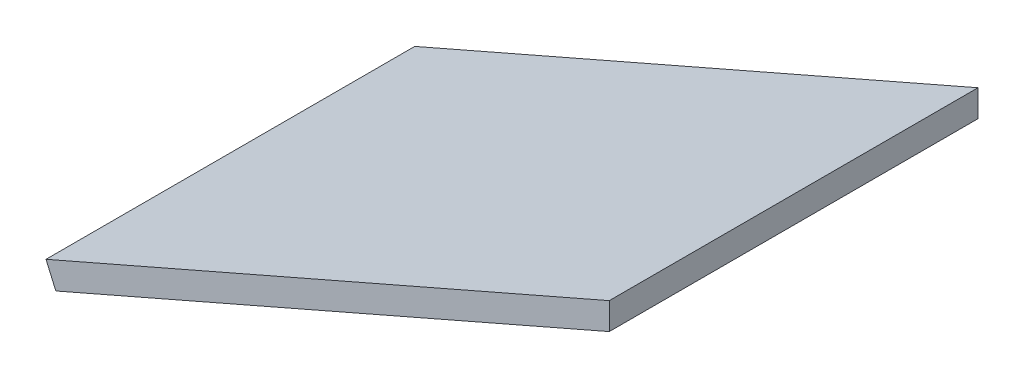
ISO-10303-21;
HEADER;
FILE_DESCRIPTION(('STEP AP214'),'2;1');
FILE_NAME('part.step','',(''),(''),'','','');
FILE_SCHEMA(('AUTOMOTIVE_DESIGN { 1 0 10303 214 1 1 1 1 }'));
ENDSEC;
DATA;
#1=APPLICATION_CONTEXT('core data for automotive mechanical design processes');
#2=APPLICATION_PROTOCOL_DEFINITION('international standard','automotive_design',2000,#1);
#3=PRODUCT_CONTEXT('',#1,'mechanical');
#4=PRODUCT('Part','Part','',(#3));
#5=PRODUCT_RELATED_PRODUCT_CATEGORY('part','',(#4));
#6=PRODUCT_DEFINITION_FORMATION('','',#4);
#7=PRODUCT_DEFINITION_CONTEXT('part definition',#1,'design');
#8=PRODUCT_DEFINITION('design','',#6,#7);
#9=PRODUCT_DEFINITION_SHAPE('','',#8);
#10=(LENGTH_UNIT() NAMED_UNIT(*) SI_UNIT(.MILLI.,.METRE.));
#11=(NAMED_UNIT(*) PLANE_ANGLE_UNIT() SI_UNIT($,.RADIAN.));
#12=(NAMED_UNIT(*) SI_UNIT($,.STERADIAN.) SOLID_ANGLE_UNIT());
#13=UNCERTAINTY_MEASURE_WITH_UNIT(LENGTH_MEASURE(1.E-05),#10,'distance_accuracy_value','');
#14=(GEOMETRIC_REPRESENTATION_CONTEXT(3) GLOBAL_UNCERTAINTY_ASSIGNED_CONTEXT((#13)) GLOBAL_UNIT_ASSIGNED_CONTEXT((#10,
#11,#12)) REPRESENTATION_CONTEXT('',''));
#15=CARTESIAN_POINT('',(0.,0.,0.));
#16=DIRECTION('',(0.,0.,1.));
#17=DIRECTION('',(1.,0.,0.));
#18=AXIS2_PLACEMENT_3D('',#15,#16,#17);
#19=CARTESIAN_POINT('',(22.1128784747792,11.8330302779824,30.));
#20=DIRECTION('',(-0.999999999999995,0.,0.));
#21=DIRECTION('',(0.,0.,0.999999999999989));
#22=AXIS2_PLACEMENT_3D('',#19,#20,#21);
#23=PLANE('',#22);
#24=DIRECTION('',(0.,0.999999999999995,0.));
#25=VECTOR('',#24,1.);
#26=CARTESIAN_POINT('',(22.1128784747792,11.8330302779824,0.));
#27=LINE('',#26,#25);
#28=CARTESIAN_POINT('',(22.1128784747792,9.65085137562245,0.));
#29=VERTEX_POINT('',#28);
#30=CARTESIAN_POINT('',(22.1128784747792,11.8330302779824,0.));
#31=VERTEX_POINT('',#30);
#32=EDGE_CURVE('E93',#29,#31,#27,.T.);
#33=ORIENTED_EDGE('',*,*,#32,.T.);
#34=DIRECTION('',(0.,0.,-0.999999999999989));
#35=VECTOR('',#34,1.);
#36=CARTESIAN_POINT('',(22.1128784747792,11.8330302779824,30.));
#37=LINE('',#36,#35);
#38=CARTESIAN_POINT('',(22.1128784747792,11.8330302779824,30.));
#39=VERTEX_POINT('',#38);
#40=EDGE_CURVE('E11',#39,#31,#37,.T.);
#41=ORIENTED_EDGE('',*,*,#40,.F.);
#42=DIRECTION('',(0.,0.999999999999995,0.));
#43=VECTOR('',#42,1.);
#44=CARTESIAN_POINT('',(22.1128784747792,11.8330302779824,30.));
#45=LINE('',#44,#43);
#46=CARTESIAN_POINT('',(22.1128784747792,9.65085137562245,30.));
#47=VERTEX_POINT('',#46);
#48=EDGE_CURVE('E81',#47,#39,#45,.T.);
#49=ORIENTED_EDGE('',*,*,#48,.F.);
#50=DIRECTION('',(0.,0.,-0.999999999999989));
#51=VECTOR('',#50,1.);
#52=CARTESIAN_POINT('',(22.1128784747792,9.65085137562245,30.));
#53=LINE('',#52,#51);
#54=EDGE_CURVE('E89',#47,#29,#53,.T.);
#55=ORIENTED_EDGE('',*,*,#54,.T.);
#56=EDGE_LOOP('',(#33,#41,#49,#55));
#57=FACE_BOUND('',#56,.T.);
#58=ADVANCED_FACE('F30',(#57),#23,.F.);
#59=CARTESIAN_POINT('',(22.1128784747792,11.8330302779824,30.));
#60=DIRECTION('',(0.400000000000001,-0.916515138991168,0.));
#61=DIRECTION('',(0.916515138991168,0.400000000000001,0.));
#62=AXIS2_PLACEMENT_3D('',#59,#60,#61);
#63=PLANE('',#62);
#64=DIRECTION('',(-0.916515138991168,-0.400000000000001,0.));
#65=VECTOR('',#64,1.);
#66=CARTESIAN_POINT('',(22.1128784747792,11.8330302779824,0.));
#67=LINE('',#66,#65);
#68=CARTESIAN_POINT('',(-23.7128784747792,-8.1669697220177,0.));
#69=VERTEX_POINT('',#68);
#70=EDGE_CURVE('E85',#31,#69,#67,.T.);
#71=ORIENTED_EDGE('',*,*,#70,.T.);
#72=DIRECTION('',(0.,0.,-0.999999999999989));
#73=VECTOR('',#72,1.);
#74=CARTESIAN_POINT('',(-23.7128784747791,-8.16696972201762,29.9999999999993));
#75=LINE('',#74,#73);
#76=CARTESIAN_POINT('',(-23.7128784747791,-8.16696972201762,29.9999999999993));
#77=VERTEX_POINT('',#76);
#78=EDGE_CURVE('E38',#77,#69,#75,.T.);
#79=ORIENTED_EDGE('',*,*,#78,.F.);
#80=DIRECTION('',(-0.916515138991168,-0.400000000000001,0.));
#81=VECTOR('',#80,1.);
#82=CARTESIAN_POINT('',(22.1128784747792,11.8330302779824,30.));
#83=LINE('',#82,#81);
#84=EDGE_CURVE('E76',#39,#77,#83,.T.);
#85=ORIENTED_EDGE('',*,*,#84,.F.);
#86=ORIENTED_EDGE('',*,*,#40,.T.);
#87=EDGE_LOOP('',(#71,#79,#85,#86));
#88=FACE_BOUND('',#87,.T.);
#89=ADVANCED_FACE('F84',(#88),#63,.F.);
#90=CARTESIAN_POINT('',(-22.912878474779,-10.0000000000001,29.9999999999993));
#91=DIRECTION('',(0.916515138991162,0.400000000000002,0.));
#92=DIRECTION('',(-0.400000000000002,0.916515138991162,0.));
#93=AXIS2_PLACEMENT_3D('',#90,#91,#92);
#94=PLANE('',#93);
#95=DIRECTION('',(0.400000000000002,-0.916515138991162,0.));
#96=VECTOR('',#95,1.);
#97=CARTESIAN_POINT('',(-22.912878474779,-10.0000000000001,0.));
#98=LINE('',#97,#96);
#99=CARTESIAN_POINT('',(-22.912878474779,-10.0000000000001,0.));
#100=VERTEX_POINT('',#99);
#101=EDGE_CURVE('E63',#69,#100,#98,.T.);
#102=ORIENTED_EDGE('',*,*,#101,.T.);
#103=DIRECTION('',(0.,0.,-0.999999999999989));
#104=VECTOR('',#103,1.);
#105=CARTESIAN_POINT('',(-22.912878474779,-10.0000000000001,29.9999999999993));
#106=LINE('',#105,#104);
#107=CARTESIAN_POINT('',(-22.912878474779,-10.0000000000001,29.9999999999993));
#108=VERTEX_POINT('',#107);
#109=EDGE_CURVE('E86',#108,#100,#106,.T.);
#110=ORIENTED_EDGE('',*,*,#109,.F.);
#111=DIRECTION('',(0.400000000000002,-0.916515138991162,0.));
#112=VECTOR('',#111,1.);
#113=CARTESIAN_POINT('',(-22.912878474779,-10.0000000000001,29.9999999999993));
#114=LINE('',#113,#112);
#115=EDGE_CURVE('E79',#77,#108,#114,.T.);
#116=ORIENTED_EDGE('',*,*,#115,.F.);
#117=ORIENTED_EDGE('',*,*,#78,.T.);
#118=EDGE_LOOP('',(#102,#110,#116,#117));
#119=FACE_BOUND('',#118,.T.);
#120=ADVANCED_FACE('F87',(#119),#94,.F.);
#121=CARTESIAN_POINT('',(22.1128784747792,9.65085137562245,30.));
#122=DIRECTION('',(-0.400000000000001,0.916515138991168,0.));
#123=DIRECTION('',(-0.916515138991168,-0.400000000000001,0.));
#124=AXIS2_PLACEMENT_3D('',#121,#122,#123);
#125=PLANE('',#124);
#126=DIRECTION('',(0.916515138991168,0.400000000000001,0.));
#127=VECTOR('',#126,1.);
#128=CARTESIAN_POINT('',(22.1128784747792,9.65085137562245,0.));
#129=LINE('',#128,#127);
#130=EDGE_CURVE('E69',#100,#29,#129,.T.);
#131=ORIENTED_EDGE('',*,*,#130,.T.);
#132=ORIENTED_EDGE('',*,*,#54,.F.);
#133=DIRECTION('',(0.916515138991168,0.400000000000001,0.));
#134=VECTOR('',#133,1.);
#135=CARTESIAN_POINT('',(22.1128784747792,9.65085137562245,30.));
#136=LINE('',#135,#134);
#137=EDGE_CURVE('E46',#108,#47,#136,.T.);
#138=ORIENTED_EDGE('',*,*,#137,.F.);
#139=ORIENTED_EDGE('',*,*,#109,.T.);
#140=EDGE_LOOP('',(#131,#132,#138,#139));
#141=FACE_BOUND('',#140,.T.);
#142=ADVANCED_FACE('F100',(#141),#125,.F.);
#143=CARTESIAN_POINT('',(0.,0.,29.9999999999993));
#144=DIRECTION('',(0.,0.,-0.999999999999989));
#145=DIRECTION('',(-0.999999999999995,0.,0.));
#146=AXIS2_PLACEMENT_3D('',#143,#144,#145);
#147=PLANE('',#146);
#148=ORIENTED_EDGE('',*,*,#48,.T.);
#149=ORIENTED_EDGE('',*,*,#84,.T.);
#150=ORIENTED_EDGE('',*,*,#115,.T.);
#151=ORIENTED_EDGE('',*,*,#137,.T.);
#152=EDGE_LOOP('',(#148,#149,#150,#151));
#153=FACE_BOUND('',#152,.T.);
#154=ADVANCED_FACE('F77',(#153),#147,.F.);
#155=CARTESIAN_POINT('',(0.,0.,0.));
#156=DIRECTION('',(0.,0.,-0.999999999999989));
#157=DIRECTION('',(-0.999999999999995,0.,0.));
#158=AXIS2_PLACEMENT_3D('',#155,#156,#157);
#159=PLANE('',#158);
#160=ORIENTED_EDGE('',*,*,#32,.F.);
#161=ORIENTED_EDGE('',*,*,#130,.F.);
#162=ORIENTED_EDGE('',*,*,#101,.F.);
#163=ORIENTED_EDGE('',*,*,#70,.F.);
#164=EDGE_LOOP('',(#160,#161,#162,#163));
#165=FACE_BOUND('',#164,.T.);
#166=ADVANCED_FACE('F103',(#165),#159,.T.);
#167=CLOSED_SHELL('',(#58,#89,#120,#142,#154,#166));
#168=MANIFOLD_SOLID_BREP('B2',#167);
#169=ADVANCED_BREP_SHAPE_REPRESENTATION('',(#18,#168),#14);
#170=SHAPE_DEFINITION_REPRESENTATION(#9,#169);
ENDSEC;
END-ISO-10303-21;
